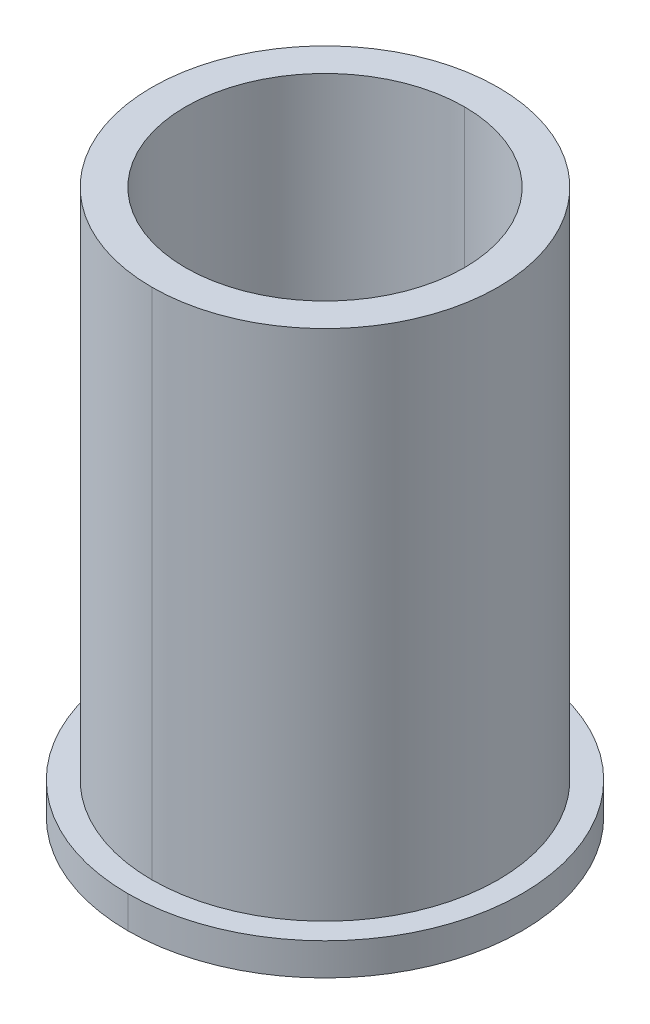
ISO-10303-21;
HEADER;
FILE_DESCRIPTION(('STEP AP214'),'2;1');
FILE_NAME('part.step','',(''),(''),'','','');
FILE_SCHEMA(('AUTOMOTIVE_DESIGN { 1 0 10303 214 1 1 1 1 }'));
ENDSEC;
DATA;
#1=APPLICATION_CONTEXT('core data for automotive mechanical design processes');
#2=APPLICATION_PROTOCOL_DEFINITION('international standard','automotive_design',2000,#1);
#3=PRODUCT_CONTEXT('',#1,'mechanical');
#4=PRODUCT('Part','Part','',(#3));
#5=PRODUCT_RELATED_PRODUCT_CATEGORY('part','',(#4));
#6=PRODUCT_DEFINITION_FORMATION('','',#4);
#7=PRODUCT_DEFINITION_CONTEXT('part definition',#1,'design');
#8=PRODUCT_DEFINITION('design','',#6,#7);
#9=PRODUCT_DEFINITION_SHAPE('','',#8);
#10=(LENGTH_UNIT() NAMED_UNIT(*) SI_UNIT(.MILLI.,.METRE.));
#11=(NAMED_UNIT(*) PLANE_ANGLE_UNIT() SI_UNIT($,.RADIAN.));
#12=(NAMED_UNIT(*) SI_UNIT($,.STERADIAN.) SOLID_ANGLE_UNIT());
#13=UNCERTAINTY_MEASURE_WITH_UNIT(LENGTH_MEASURE(1.E-05),#10,'distance_accuracy_value','');
#14=(GEOMETRIC_REPRESENTATION_CONTEXT(3) GLOBAL_UNCERTAINTY_ASSIGNED_CONTEXT((#13)) GLOBAL_UNIT_ASSIGNED_CONTEXT((#10,
#11,#12)) REPRESENTATION_CONTEXT('',''));
#15=CARTESIAN_POINT('',(0.,0.,0.));
#16=DIRECTION('',(0.,0.,1.));
#17=DIRECTION('',(1.,0.,0.));
#18=AXIS2_PLACEMENT_3D('',#15,#16,#17);
#19=CARTESIAN_POINT('',(0.,0.,0.));
#20=DIRECTION('',(0.,-1.,0.));
#21=DIRECTION('',(0.,0.,-1.));
#22=AXIS2_PLACEMENT_3D('',#19,#20,#21);
#23=CONICAL_SURFACE('',#22,10.7315,0.785398163397448);
#24=CARTESIAN_POINT('',(0.,0.508,0.));
#25=DIRECTION('',(0.,-1.,0.));
#26=DIRECTION('',(0.,0.,1.));
#27=AXIS2_PLACEMENT_3D('',#24,#25,#26);
#28=CIRCLE('',#27,10.2235);
#29=CARTESIAN_POINT('',(0.,0.508,10.2235));
#30=VERTEX_POINT('',#29);
#31=CARTESIAN_POINT('',(0.,0.508,-10.2235));
#32=VERTEX_POINT('',#31);
#33=EDGE_CURVE('E140',#30,#32,#28,.T.);
#34=ORIENTED_EDGE('',*,*,#33,.F.);
#35=DIRECTION('',(0.,-0.707106781186548,0.707106781186548));
#36=VECTOR('',#35,1.);
#37=CARTESIAN_POINT('',(0.,0.,10.7315));
#38=LINE('',#37,#36);
#39=CARTESIAN_POINT('',(0.,0.,10.7315));
#40=VERTEX_POINT('',#39);
#41=EDGE_CURVE('E46',#30,#40,#38,.T.);
#42=ORIENTED_EDGE('',*,*,#41,.T.);
#43=CARTESIAN_POINT('',(0.,0.,0.));
#44=DIRECTION('',(0.,1.,0.));
#45=DIRECTION('',(0.,0.,1.));
#46=AXIS2_PLACEMENT_3D('',#43,#44,#45);
#47=CIRCLE('',#46,10.7315);
#48=CARTESIAN_POINT('',(0.,0.,-10.7315));
#49=VERTEX_POINT('',#48);
#50=EDGE_CURVE('E135',#49,#40,#47,.T.);
#51=ORIENTED_EDGE('',*,*,#50,.F.);
#52=DIRECTION('',(0.,-0.707106781186548,-0.707106781186548));
#53=VECTOR('',#52,1.);
#54=CARTESIAN_POINT('',(0.,0.,-10.7315));
#55=LINE('',#54,#53);
#56=EDGE_CURVE('E168',#32,#49,#55,.T.);
#57=ORIENTED_EDGE('',*,*,#56,.F.);
#58=EDGE_LOOP('',(#34,#42,#51,#57));
#59=FACE_BOUND('',#58,.T.);
#60=ADVANCED_FACE('F38',(#59),#23,.F.);
#61=CARTESIAN_POINT('',(0.,57.0992,0.));
#62=DIRECTION('',(0.,-1.,0.));
#63=DIRECTION('',(0.,0.,-1.));
#64=AXIS2_PLACEMENT_3D('',#61,#62,#63);
#65=CYLINDRICAL_SURFACE('',#64,12.69619);
#66=CARTESIAN_POINT('',(0.,40.,0.));
#67=DIRECTION('',(0.,-1.,0.));
#68=DIRECTION('',(0.,0.,-1.));
#69=AXIS2_PLACEMENT_3D('',#66,#67,#68);
#70=CIRCLE('',#69,12.69619);
#71=CARTESIAN_POINT('',(0.,40.,12.69619));
#72=VERTEX_POINT('',#71);
#73=CARTESIAN_POINT('',(0.,40.,-12.69619));
#74=VERTEX_POINT('',#73);
#75=EDGE_CURVE('E58',#72,#74,#70,.F.);
#76=ORIENTED_EDGE('',*,*,#75,.F.);
#77=DIRECTION('',(0.,-1.,0.));
#78=VECTOR('',#77,1.);
#79=CARTESIAN_POINT('',(0.,57.0992,12.69619));
#80=LINE('',#79,#78);
#81=CARTESIAN_POINT('',(0.,2.3622,12.69619));
#82=VERTEX_POINT('',#81);
#83=EDGE_CURVE('E110',#72,#82,#80,.T.);
#84=ORIENTED_EDGE('',*,*,#83,.T.);
#85=CARTESIAN_POINT('',(0.,2.3622,0.));
#86=DIRECTION('',(0.,1.,0.));
#87=DIRECTION('',(0.,0.,1.));
#88=AXIS2_PLACEMENT_3D('',#85,#86,#87);
#89=CIRCLE('',#88,12.69619);
#90=CARTESIAN_POINT('',(0.,2.3622,-12.69619));
#91=VERTEX_POINT('',#90);
#92=EDGE_CURVE('E119',#82,#91,#89,.T.);
#93=ORIENTED_EDGE('',*,*,#92,.T.);
#94=DIRECTION('',(0.,-1.,0.));
#95=VECTOR('',#94,1.);
#96=CARTESIAN_POINT('',(0.,57.0992,-12.69619));
#97=LINE('',#96,#95);
#98=EDGE_CURVE('E112',#74,#91,#97,.T.);
#99=ORIENTED_EDGE('',*,*,#98,.F.);
#100=EDGE_LOOP('',(#76,#84,#93,#99));
#101=FACE_BOUND('',#100,.T.);
#102=ADVANCED_FACE('F108',(#101),#65,.T.);
#103=CARTESIAN_POINT('',(0.,2.3622,0.));
#104=DIRECTION('',(0.,-1.,0.));
#105=DIRECTION('',(0.,0.,-1.));
#106=AXIS2_PLACEMENT_3D('',#103,#104,#105);
#107=CYLINDRICAL_SURFACE('',#106,10.2235);
#108=DIRECTION('',(0.,-1.,0.));
#109=VECTOR('',#108,1.);
#110=CARTESIAN_POINT('',(0.,2.3622,-10.2235));
#111=LINE('',#110,#109);
#112=CARTESIAN_POINT('',(0.,40.,-10.2235));
#113=VERTEX_POINT('',#112);
#114=EDGE_CURVE('E145',#113,#32,#111,.T.);
#115=ORIENTED_EDGE('',*,*,#114,.F.);
#116=CARTESIAN_POINT('',(0.,40.,0.));
#117=DIRECTION('',(0.,-1.,0.));
#118=DIRECTION('',(0.,0.,-1.));
#119=AXIS2_PLACEMENT_3D('',#116,#117,#118);
#120=CIRCLE('',#119,10.2235);
#121=CARTESIAN_POINT('',(0.,40.,10.2235));
#122=VERTEX_POINT('',#121);
#123=EDGE_CURVE('E52',#113,#122,#120,.F.);
#124=ORIENTED_EDGE('',*,*,#123,.T.);
#125=DIRECTION('',(0.,-1.,0.));
#126=VECTOR('',#125,1.);
#127=CARTESIAN_POINT('',(0.,2.3622,10.2235));
#128=LINE('',#127,#126);
#129=EDGE_CURVE('E125',#122,#30,#128,.T.);
#130=ORIENTED_EDGE('',*,*,#129,.T.);
#131=ORIENTED_EDGE('',*,*,#33,.T.);
#132=EDGE_LOOP('',(#115,#124,#130,#131));
#133=FACE_BOUND('',#132,.T.);
#134=ADVANCED_FACE('F214',(#133),#107,.F.);
#135=CARTESIAN_POINT('',(0.,2.3622,0.));
#136=DIRECTION('',(0.,-1.,0.));
#137=DIRECTION('',(0.,0.,-1.));
#138=AXIS2_PLACEMENT_3D('',#135,#136,#137);
#139=CYLINDRICAL_SURFACE('',#138,14.4526);
#140=CARTESIAN_POINT('',(0.,2.3622,0.));
#141=DIRECTION('',(0.,1.,0.));
#142=DIRECTION('',(0.,0.,1.));
#143=AXIS2_PLACEMENT_3D('',#140,#141,#142);
#144=CIRCLE('',#143,14.4526);
#145=CARTESIAN_POINT('',(0.,2.3622,14.4526));
#146=VERTEX_POINT('',#145);
#147=CARTESIAN_POINT('',(0.,2.3622,-14.4526));
#148=VERTEX_POINT('',#147);
#149=EDGE_CURVE('E130',#146,#148,#144,.T.);
#150=ORIENTED_EDGE('',*,*,#149,.F.);
#151=DIRECTION('',(0.,-1.,0.));
#152=VECTOR('',#151,1.);
#153=CARTESIAN_POINT('',(0.,2.3622,14.4526));
#154=LINE('',#153,#152);
#155=CARTESIAN_POINT('',(0.,0.,14.4526));
#156=VERTEX_POINT('',#155);
#157=EDGE_CURVE('E136',#146,#156,#154,.T.);
#158=ORIENTED_EDGE('',*,*,#157,.T.);
#159=CARTESIAN_POINT('',(0.,0.,0.));
#160=DIRECTION('',(0.,1.,0.));
#161=DIRECTION('',(0.,0.,1.));
#162=AXIS2_PLACEMENT_3D('',#159,#160,#161);
#163=CIRCLE('',#162,14.4526);
#164=CARTESIAN_POINT('',(0.,0.,-14.4526));
#165=VERTEX_POINT('',#164);
#166=EDGE_CURVE('E141',#156,#165,#163,.T.);
#167=ORIENTED_EDGE('',*,*,#166,.T.);
#168=DIRECTION('',(0.,-1.,0.));
#169=VECTOR('',#168,1.);
#170=CARTESIAN_POINT('',(0.,2.3622,-14.4526));
#171=LINE('',#170,#169);
#172=EDGE_CURVE('E158',#148,#165,#171,.T.);
#173=ORIENTED_EDGE('',*,*,#172,.F.);
#174=EDGE_LOOP('',(#150,#158,#167,#173));
#175=FACE_BOUND('',#174,.T.);
#176=ADVANCED_FACE('F190',(#175),#139,.T.);
#177=CARTESIAN_POINT('',(0.,2.3622,0.));
#178=DIRECTION('',(0.,1.,0.));
#179=DIRECTION('',(1.,0.,0.));
#180=AXIS2_PLACEMENT_3D('',#177,#178,#179);
#181=PLANE('',#180);
#182=CARTESIAN_POINT('',(0.,2.3622,0.));
#183=DIRECTION('',(0.,1.,0.));
#184=DIRECTION('',(0.,0.,1.));
#185=AXIS2_PLACEMENT_3D('',#182,#183,#184);
#186=CIRCLE('',#185,14.4526);
#187=EDGE_CURVE('E134',#148,#146,#186,.T.);
#188=ORIENTED_EDGE('',*,*,#187,.T.);
#189=ORIENTED_EDGE('',*,*,#149,.T.);
#190=EDGE_LOOP('',(#188,#189));
#191=FACE_BOUND('',#190,.T.);
#192=CARTESIAN_POINT('',(0.,2.3622,0.));
#193=DIRECTION('',(0.,1.,0.));
#194=DIRECTION('',(0.,0.,1.));
#195=AXIS2_PLACEMENT_3D('',#192,#193,#194);
#196=CIRCLE('',#195,12.69619);
#197=EDGE_CURVE('E118',#91,#82,#196,.T.);
#198=ORIENTED_EDGE('',*,*,#197,.F.);
#199=ORIENTED_EDGE('',*,*,#92,.F.);
#200=EDGE_LOOP('',(#198,#199));
#201=FACE_BOUND('',#200,.T.);
#202=ADVANCED_FACE('F194',(#191,#201),#181,.T.);
#203=CARTESIAN_POINT('',(0.,0.,0.));
#204=DIRECTION('',(0.,1.,0.));
#205=DIRECTION('',(1.,0.,0.));
#206=AXIS2_PLACEMENT_3D('',#203,#204,#205);
#207=PLANE('',#206);
#208=CARTESIAN_POINT('',(0.,0.,0.));
#209=DIRECTION('',(0.,1.,0.));
#210=DIRECTION('',(0.,0.,1.));
#211=AXIS2_PLACEMENT_3D('',#208,#209,#210);
#212=CIRCLE('',#211,14.4526);
#213=EDGE_CURVE('E147',#165,#156,#212,.T.);
#214=ORIENTED_EDGE('',*,*,#213,.F.);
#215=ORIENTED_EDGE('',*,*,#166,.F.);
#216=EDGE_LOOP('',(#214,#215));
#217=FACE_BOUND('',#216,.T.);
#218=ORIENTED_EDGE('',*,*,#50,.T.);
#219=CARTESIAN_POINT('',(0.,0.,0.));
#220=DIRECTION('',(0.,1.,0.));
#221=DIRECTION('',(0.,0.,1.));
#222=AXIS2_PLACEMENT_3D('',#219,#220,#221);
#223=CIRCLE('',#222,10.7315);
#224=EDGE_CURVE('E144',#40,#49,#223,.T.);
#225=ORIENTED_EDGE('',*,*,#224,.T.);
#226=EDGE_LOOP('',(#218,#225));
#227=FACE_BOUND('',#226,.T.);
#228=ADVANCED_FACE('F40',(#217,#227),#207,.F.);
#229=CARTESIAN_POINT('',(0.,2.3622,0.));
#230=DIRECTION('',(0.,-1.,0.));
#231=DIRECTION('',(0.,0.,-1.));
#232=AXIS2_PLACEMENT_3D('',#229,#230,#231);
#233=CYLINDRICAL_SURFACE('',#232,14.4526);
#234=ORIENTED_EDGE('',*,*,#157,.F.);
#235=ORIENTED_EDGE('',*,*,#187,.F.);
#236=ORIENTED_EDGE('',*,*,#172,.T.);
#237=ORIENTED_EDGE('',*,*,#213,.T.);
#238=EDGE_LOOP('',(#234,#235,#236,#237));
#239=FACE_BOUND('',#238,.T.);
#240=ADVANCED_FACE('F187',(#239),#233,.T.);
#241=CARTESIAN_POINT('',(0.,2.3622,0.));
#242=DIRECTION('',(0.,-1.,0.));
#243=DIRECTION('',(0.,0.,-1.));
#244=AXIS2_PLACEMENT_3D('',#241,#242,#243);
#245=CYLINDRICAL_SURFACE('',#244,10.2235);
#246=ORIENTED_EDGE('',*,*,#129,.F.);
#247=CARTESIAN_POINT('',(0.,40.,0.));
#248=DIRECTION('',(0.,-1.,0.));
#249=DIRECTION('',(0.,0.,-1.));
#250=AXIS2_PLACEMENT_3D('',#247,#248,#249);
#251=CIRCLE('',#250,10.2235);
#252=EDGE_CURVE('E113',#122,#113,#251,.F.);
#253=ORIENTED_EDGE('',*,*,#252,.T.);
#254=ORIENTED_EDGE('',*,*,#114,.T.);
#255=CARTESIAN_POINT('',(0.,0.508,0.));
#256=DIRECTION('',(0.,-1.,0.));
#257=DIRECTION('',(0.,0.,1.));
#258=AXIS2_PLACEMENT_3D('',#255,#256,#257);
#259=CIRCLE('',#258,10.2235);
#260=EDGE_CURVE('E148',#32,#30,#259,.T.);
#261=ORIENTED_EDGE('',*,*,#260,.T.);
#262=EDGE_LOOP('',(#246,#253,#254,#261));
#263=FACE_BOUND('',#262,.T.);
#264=ADVANCED_FACE('F206',(#263),#245,.F.);
#265=CARTESIAN_POINT('',(0.,57.0992,0.));
#266=DIRECTION('',(0.,-1.,0.));
#267=DIRECTION('',(0.,0.,-1.));
#268=AXIS2_PLACEMENT_3D('',#265,#266,#267);
#269=CYLINDRICAL_SURFACE('',#268,12.69619);
#270=ORIENTED_EDGE('',*,*,#83,.F.);
#271=CARTESIAN_POINT('',(0.,40.,0.));
#272=DIRECTION('',(0.,-1.,0.));
#273=DIRECTION('',(0.,0.,-1.));
#274=AXIS2_PLACEMENT_3D('',#271,#272,#273);
#275=CIRCLE('',#274,12.69619);
#276=EDGE_CURVE('E11',#74,#72,#275,.F.);
#277=ORIENTED_EDGE('',*,*,#276,.F.);
#278=ORIENTED_EDGE('',*,*,#98,.T.);
#279=ORIENTED_EDGE('',*,*,#197,.T.);
#280=EDGE_LOOP('',(#270,#277,#278,#279));
#281=FACE_BOUND('',#280,.T.);
#282=ADVANCED_FACE('F116',(#281),#269,.T.);
#283=CARTESIAN_POINT('',(0.,0.,0.));
#284=DIRECTION('',(0.,-1.,0.));
#285=DIRECTION('',(0.,0.,-1.));
#286=AXIS2_PLACEMENT_3D('',#283,#284,#285);
#287=CONICAL_SURFACE('',#286,10.7315,0.785398163397448);
#288=ORIENTED_EDGE('',*,*,#41,.F.);
#289=ORIENTED_EDGE('',*,*,#260,.F.);
#290=ORIENTED_EDGE('',*,*,#56,.T.);
#291=ORIENTED_EDGE('',*,*,#224,.F.);
#292=EDGE_LOOP('',(#288,#289,#290,#291));
#293=FACE_BOUND('',#292,.T.);
#294=ADVANCED_FACE('F198',(#293),#287,.F.);
#295=CARTESIAN_POINT('',(-12.69619,40.,-14.4526));
#296=DIRECTION('',(0.,-1.,0.));
#297=DIRECTION('',(0.,0.,-1.));
#298=AXIS2_PLACEMENT_3D('',#295,#296,#297);
#299=PLANE('',#298);
#300=ORIENTED_EDGE('',*,*,#75,.T.);
#301=ORIENTED_EDGE('',*,*,#276,.T.);
#302=EDGE_LOOP('',(#300,#301));
#303=FACE_BOUND('',#302,.T.);
#304=ORIENTED_EDGE('',*,*,#252,.F.);
#305=ORIENTED_EDGE('',*,*,#123,.F.);
#306=EDGE_LOOP('',(#304,#305));
#307=FACE_BOUND('',#306,.T.);
#308=ADVANCED_FACE('F103',(#303,#307),#299,.F.);
#309=CLOSED_SHELL('',(#60,#102,#134,#176,#202,#228,#240,#264,#282,#294,#308));
#310=MANIFOLD_SOLID_BREP('B2',#309);
#311=ADVANCED_BREP_SHAPE_REPRESENTATION('',(#18,#310),#14);
#312=SHAPE_DEFINITION_REPRESENTATION(#9,#311);
ENDSEC;
END-ISO-10303-21;
